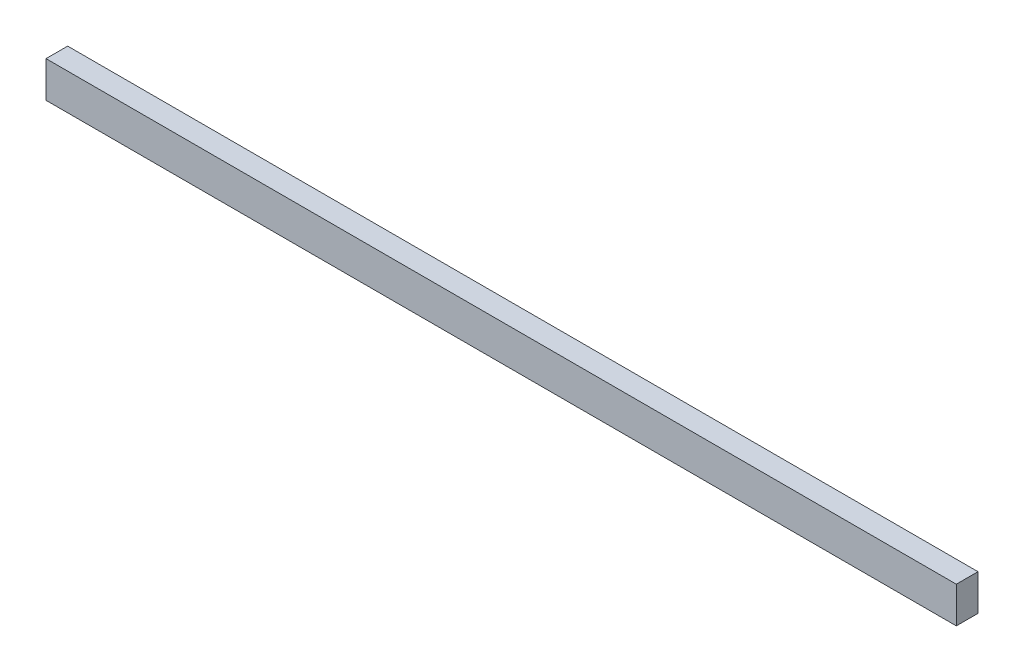
ISO-10303-21;
HEADER;
FILE_DESCRIPTION(('STEP AP214'),'2;1');
FILE_NAME('part.step','',(''),(''),'','','');
FILE_SCHEMA(('AUTOMOTIVE_DESIGN { 1 0 10303 214 1 1 1 1 }'));
ENDSEC;
DATA;
#1=APPLICATION_CONTEXT('core data for automotive mechanical design processes');
#2=APPLICATION_PROTOCOL_DEFINITION('international standard','automotive_design',2000,#1);
#3=PRODUCT_CONTEXT('',#1,'mechanical');
#4=PRODUCT('Part','Part','',(#3));
#5=PRODUCT_RELATED_PRODUCT_CATEGORY('part','',(#4));
#6=PRODUCT_DEFINITION_FORMATION('','',#4);
#7=PRODUCT_DEFINITION_CONTEXT('part definition',#1,'design');
#8=PRODUCT_DEFINITION('design','',#6,#7);
#9=PRODUCT_DEFINITION_SHAPE('','',#8);
#10=(LENGTH_UNIT() NAMED_UNIT(*) SI_UNIT(.MILLI.,.METRE.));
#11=(NAMED_UNIT(*) PLANE_ANGLE_UNIT() SI_UNIT($,.RADIAN.));
#12=(NAMED_UNIT(*) SI_UNIT($,.STERADIAN.) SOLID_ANGLE_UNIT());
#13=UNCERTAINTY_MEASURE_WITH_UNIT(LENGTH_MEASURE(1.E-05),#10,'distance_accuracy_value','');
#14=(GEOMETRIC_REPRESENTATION_CONTEXT(3) GLOBAL_UNCERTAINTY_ASSIGNED_CONTEXT((#13)) GLOBAL_UNIT_ASSIGNED_CONTEXT((#10,
#11,#12)) REPRESENTATION_CONTEXT('',''));
#15=CARTESIAN_POINT('',(0.,0.,0.));
#16=DIRECTION('',(0.,0.,1.));
#17=DIRECTION('',(1.,0.,0.));
#18=AXIS2_PLACEMENT_3D('',#15,#16,#17);
#19=CARTESIAN_POINT('',(400.05,31.75,9.525));
#20=DIRECTION('',(-1.,0.,0.));
#21=DIRECTION('',(0.,0.,1.));
#22=AXIS2_PLACEMENT_3D('',#19,#20,#21);
#23=PLANE('',#22);
#24=DIRECTION('',(0.,0.,-1.));
#25=VECTOR('',#24,1.);
#26=CARTESIAN_POINT('',(400.05,0.,9.525));
#27=LINE('',#26,#25);
#28=CARTESIAN_POINT('',(400.05,0.,9.525));
#29=VERTEX_POINT('',#28);
#30=CARTESIAN_POINT('',(400.05,0.,-9.525));
#31=VERTEX_POINT('',#30);
#32=EDGE_CURVE('E97',#29,#31,#27,.T.);
#33=ORIENTED_EDGE('',*,*,#32,.T.);
#34=DIRECTION('',(0.,-1.,0.));
#35=VECTOR('',#34,1.);
#36=CARTESIAN_POINT('',(400.05,31.75,-9.525));
#37=LINE('',#36,#35);
#38=CARTESIAN_POINT('',(400.05,31.75,-9.525));
#39=VERTEX_POINT('',#38);
#40=EDGE_CURVE('E11',#39,#31,#37,.T.);
#41=ORIENTED_EDGE('',*,*,#40,.F.);
#42=DIRECTION('',(0.,0.,-1.));
#43=VECTOR('',#42,1.);
#44=CARTESIAN_POINT('',(400.05,31.75,9.525));
#45=LINE('',#44,#43);
#46=CARTESIAN_POINT('',(400.05,31.75,9.525));
#47=VERTEX_POINT('',#46);
#48=EDGE_CURVE('E85',#47,#39,#45,.T.);
#49=ORIENTED_EDGE('',*,*,#48,.F.);
#50=DIRECTION('',(0.,-1.,0.));
#51=VECTOR('',#50,1.);
#52=CARTESIAN_POINT('',(400.05,31.75,9.525));
#53=LINE('',#52,#51);
#54=EDGE_CURVE('E93',#47,#29,#53,.T.);
#55=ORIENTED_EDGE('',*,*,#54,.T.);
#56=EDGE_LOOP('',(#33,#41,#49,#55));
#57=FACE_BOUND('',#56,.T.);
#58=ADVANCED_FACE('F34',(#57),#23,.F.);
#59=CARTESIAN_POINT('',(-400.05,31.75,-9.525));
#60=DIRECTION('',(0.,0.,1.));
#61=DIRECTION('',(1.,0.,0.));
#62=AXIS2_PLACEMENT_3D('',#59,#60,#61);
#63=PLANE('',#62);
#64=DIRECTION('',(-1.,0.,0.));
#65=VECTOR('',#64,1.);
#66=CARTESIAN_POINT('',(-400.05,0.,-9.525));
#67=LINE('',#66,#65);
#68=CARTESIAN_POINT('',(-400.05,0.,-9.525));
#69=VERTEX_POINT('',#68);
#70=EDGE_CURVE('E89',#31,#69,#67,.T.);
#71=ORIENTED_EDGE('',*,*,#70,.T.);
#72=DIRECTION('',(0.,-1.,0.));
#73=VECTOR('',#72,1.);
#74=CARTESIAN_POINT('',(-400.05,31.75,-9.525));
#75=LINE('',#74,#73);
#76=CARTESIAN_POINT('',(-400.05,31.75,-9.525));
#77=VERTEX_POINT('',#76);
#78=EDGE_CURVE('E42',#77,#69,#75,.T.);
#79=ORIENTED_EDGE('',*,*,#78,.F.);
#80=DIRECTION('',(-1.,0.,0.));
#81=VECTOR('',#80,1.);
#82=CARTESIAN_POINT('',(-400.05,31.75,-9.525));
#83=LINE('',#82,#81);
#84=EDGE_CURVE('E80',#39,#77,#83,.T.);
#85=ORIENTED_EDGE('',*,*,#84,.F.);
#86=ORIENTED_EDGE('',*,*,#40,.T.);
#87=EDGE_LOOP('',(#71,#79,#85,#86));
#88=FACE_BOUND('',#87,.T.);
#89=ADVANCED_FACE('F88',(#88),#63,.F.);
#90=CARTESIAN_POINT('',(-400.05,31.75,9.525));
#91=DIRECTION('',(1.,0.,0.));
#92=DIRECTION('',(0.,0.,-1.));
#93=AXIS2_PLACEMENT_3D('',#90,#91,#92);
#94=PLANE('',#93);
#95=DIRECTION('',(0.,0.,1.));
#96=VECTOR('',#95,1.);
#97=CARTESIAN_POINT('',(-400.05,0.,9.525));
#98=LINE('',#97,#96);
#99=CARTESIAN_POINT('',(-400.05,0.,9.525));
#100=VERTEX_POINT('',#99);
#101=EDGE_CURVE('E67',#69,#100,#98,.T.);
#102=ORIENTED_EDGE('',*,*,#101,.T.);
#103=DIRECTION('',(0.,-1.,0.));
#104=VECTOR('',#103,1.);
#105=CARTESIAN_POINT('',(-400.05,31.75,9.525));
#106=LINE('',#105,#104);
#107=CARTESIAN_POINT('',(-400.05,31.75,9.525));
#108=VERTEX_POINT('',#107);
#109=EDGE_CURVE('E90',#108,#100,#106,.T.);
#110=ORIENTED_EDGE('',*,*,#109,.F.);
#111=DIRECTION('',(0.,0.,1.));
#112=VECTOR('',#111,1.);
#113=CARTESIAN_POINT('',(-400.05,31.75,9.525));
#114=LINE('',#113,#112);
#115=EDGE_CURVE('E83',#77,#108,#114,.T.);
#116=ORIENTED_EDGE('',*,*,#115,.F.);
#117=ORIENTED_EDGE('',*,*,#78,.T.);
#118=EDGE_LOOP('',(#102,#110,#116,#117));
#119=FACE_BOUND('',#118,.T.);
#120=ADVANCED_FACE('F91',(#119),#94,.F.);
#121=CARTESIAN_POINT('',(-400.05,31.75,9.525));
#122=DIRECTION('',(0.,0.,-1.));
#123=DIRECTION('',(-1.,0.,0.));
#124=AXIS2_PLACEMENT_3D('',#121,#122,#123);
#125=PLANE('',#124);
#126=DIRECTION('',(1.,0.,0.));
#127=VECTOR('',#126,1.);
#128=CARTESIAN_POINT('',(-400.05,0.,9.525));
#129=LINE('',#128,#127);
#130=EDGE_CURVE('E73',#100,#29,#129,.T.);
#131=ORIENTED_EDGE('',*,*,#130,.T.);
#132=ORIENTED_EDGE('',*,*,#54,.F.);
#133=DIRECTION('',(1.,0.,0.));
#134=VECTOR('',#133,1.);
#135=CARTESIAN_POINT('',(-400.05,31.75,9.525));
#136=LINE('',#135,#134);
#137=EDGE_CURVE('E50',#108,#47,#136,.T.);
#138=ORIENTED_EDGE('',*,*,#137,.F.);
#139=ORIENTED_EDGE('',*,*,#109,.T.);
#140=EDGE_LOOP('',(#131,#132,#138,#139));
#141=FACE_BOUND('',#140,.T.);
#142=ADVANCED_FACE('F104',(#141),#125,.F.);
#143=CARTESIAN_POINT('',(0.,31.75,0.));
#144=DIRECTION('',(0.,-1.,0.));
#145=DIRECTION('',(0.,0.,-1.));
#146=AXIS2_PLACEMENT_3D('',#143,#144,#145);
#147=PLANE('',#146);
#148=ORIENTED_EDGE('',*,*,#48,.T.);
#149=ORIENTED_EDGE('',*,*,#84,.T.);
#150=ORIENTED_EDGE('',*,*,#115,.T.);
#151=ORIENTED_EDGE('',*,*,#137,.T.);
#152=EDGE_LOOP('',(#148,#149,#150,#151));
#153=FACE_BOUND('',#152,.T.);
#154=ADVANCED_FACE('F81',(#153),#147,.F.);
#155=CARTESIAN_POINT('',(0.,0.,0.));
#156=DIRECTION('',(0.,-1.,0.));
#157=DIRECTION('',(0.,0.,-1.));
#158=AXIS2_PLACEMENT_3D('',#155,#156,#157);
#159=PLANE('',#158);
#160=ORIENTED_EDGE('',*,*,#32,.F.);
#161=ORIENTED_EDGE('',*,*,#130,.F.);
#162=ORIENTED_EDGE('',*,*,#101,.F.);
#163=ORIENTED_EDGE('',*,*,#70,.F.);
#164=EDGE_LOOP('',(#160,#161,#162,#163));
#165=FACE_BOUND('',#164,.T.);
#166=ADVANCED_FACE('F107',(#165),#159,.T.);
#167=CLOSED_SHELL('',(#58,#89,#120,#142,#154,#166));
#168=MANIFOLD_SOLID_BREP('B2',#167);
#169=ADVANCED_BREP_SHAPE_REPRESENTATION('',(#18,#168),#14);
#170=SHAPE_DEFINITION_REPRESENTATION(#9,#169);
ENDSEC;
END-ISO-10303-21;
